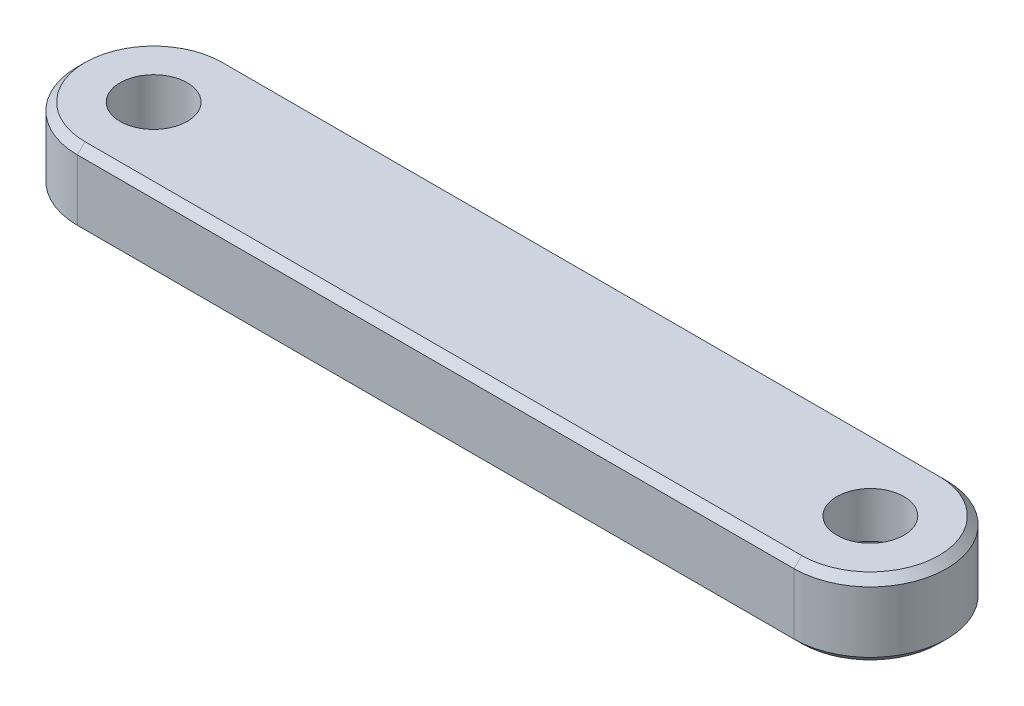
ISO-10303-21;
HEADER;
FILE_DESCRIPTION(('STEP AP214'),'2;1');
FILE_NAME('part.step','',(''),(''),'','','');
FILE_SCHEMA(('AUTOMOTIVE_DESIGN { 1 0 10303 214 1 1 1 1 }'));
ENDSEC;
DATA;
#1=APPLICATION_CONTEXT('core data for automotive mechanical design processes');
#2=APPLICATION_PROTOCOL_DEFINITION('international standard','automotive_design',2000,#1);
#3=PRODUCT_CONTEXT('',#1,'mechanical');
#4=PRODUCT('Part','Part','',(#3));
#5=PRODUCT_RELATED_PRODUCT_CATEGORY('part','',(#4));
#6=PRODUCT_DEFINITION_FORMATION('','',#4);
#7=PRODUCT_DEFINITION_CONTEXT('part definition',#1,'design');
#8=PRODUCT_DEFINITION('design','',#6,#7);
#9=PRODUCT_DEFINITION_SHAPE('','',#8);
#10=(LENGTH_UNIT() NAMED_UNIT(*) SI_UNIT(.MILLI.,.METRE.));
#11=(NAMED_UNIT(*) PLANE_ANGLE_UNIT() SI_UNIT($,.RADIAN.));
#12=(NAMED_UNIT(*) SI_UNIT($,.STERADIAN.) SOLID_ANGLE_UNIT());
#13=UNCERTAINTY_MEASURE_WITH_UNIT(LENGTH_MEASURE(1.E-05),#10,'distance_accuracy_value','');
#14=(GEOMETRIC_REPRESENTATION_CONTEXT(3) GLOBAL_UNCERTAINTY_ASSIGNED_CONTEXT((#13)) GLOBAL_UNIT_ASSIGNED_CONTEXT((#10,
#11,#12)) REPRESENTATION_CONTEXT('',''));
#15=CARTESIAN_POINT('',(0.,0.,0.));
#16=DIRECTION('',(0.,0.,1.));
#17=DIRECTION('',(1.,0.,0.));
#18=AXIS2_PLACEMENT_3D('',#15,#16,#17);
#19=CARTESIAN_POINT('',(47.,-0.0001,0.));
#20=DIRECTION('',(0.,1.,0.));
#21=DIRECTION('',(0.,0.,1.));
#22=AXIS2_PLACEMENT_3D('',#19,#20,#21);
#23=CYLINDRICAL_SURFACE('',#22,2.19999999999998);
#24=CARTESIAN_POINT('',(47.,5.,0.));
#25=DIRECTION('',(0.,1.,0.));
#26=DIRECTION('',(0.,0.,1.));
#27=AXIS2_PLACEMENT_3D('',#24,#25,#26);
#28=CIRCLE('',#27,2.19999999999998);
#29=CARTESIAN_POINT('',(47.,5.,2.19999999999998));
#30=VERTEX_POINT('',#29);
#31=EDGE_CURVE('E250',#30,#30,#28,.T.);
#32=ORIENTED_EDGE('',*,*,#31,.T.);
#33=EDGE_LOOP('',(#32));
#34=FACE_BOUND('',#33,.T.);
#35=CARTESIAN_POINT('',(47.,1.9999,0.));
#36=DIRECTION('',(0.,-1.,0.));
#37=DIRECTION('',(0.,0.,-1.));
#38=AXIS2_PLACEMENT_3D('',#35,#36,#37);
#39=CIRCLE('',#38,2.19999999999998);
#40=CARTESIAN_POINT('',(47.,1.9999,-2.19999999999998));
#41=VERTEX_POINT('',#40);
#42=EDGE_CURVE('E199',#41,#41,#39,.T.);
#43=ORIENTED_EDGE('',*,*,#42,.T.);
#44=EDGE_LOOP('',(#43));
#45=FACE_BOUND('',#44,.T.);
#46=ADVANCED_FACE('F96',(#34,#45),#23,.F.);
#47=CARTESIAN_POINT('',(0.,-0.0001,0.));
#48=DIRECTION('',(0.,1.,0.));
#49=DIRECTION('',(0.,0.,1.));
#50=AXIS2_PLACEMENT_3D('',#47,#48,#49);
#51=CYLINDRICAL_SURFACE('',#50,5.);
#52=DIRECTION('',(0.,1.,0.));
#53=VECTOR('',#52,1.);
#54=CARTESIAN_POINT('',(0.,-0.0001,5.));
#55=LINE('',#54,#53);
#56=CARTESIAN_POINT('',(0.,0.499900000000007,5.));
#57=VERTEX_POINT('',#56);
#58=CARTESIAN_POINT('',(0.,4.50000000000001,5.));
#59=VERTEX_POINT('',#58);
#60=EDGE_CURVE('E235',#57,#59,#55,.T.);
#61=ORIENTED_EDGE('',*,*,#60,.T.);
#62=CARTESIAN_POINT('',(0.,4.50000000000001,0.));
#63=DIRECTION('',(0.,1.,0.));
#64=DIRECTION('',(0.,0.,1.));
#65=AXIS2_PLACEMENT_3D('',#62,#63,#64);
#66=CIRCLE('',#65,5.);
#67=CARTESIAN_POINT('',(0.,4.50000000000001,-5.));
#68=VERTEX_POINT('',#67);
#69=EDGE_CURVE('E210',#59,#68,#66,.F.);
#70=ORIENTED_EDGE('',*,*,#69,.T.);
#71=DIRECTION('',(0.,1.,0.));
#72=VECTOR('',#71,1.);
#73=CARTESIAN_POINT('',(0.,-0.0001,-5.));
#74=LINE('',#73,#72);
#75=CARTESIAN_POINT('',(0.,0.499900000000007,-5.));
#76=VERTEX_POINT('',#75);
#77=EDGE_CURVE('E234',#76,#68,#74,.T.);
#78=ORIENTED_EDGE('',*,*,#77,.F.);
#79=CARTESIAN_POINT('',(0.,0.499900000000007,0.));
#80=DIRECTION('',(0.,1.,0.));
#81=DIRECTION('',(0.,0.,1.));
#82=AXIS2_PLACEMENT_3D('',#79,#80,#81);
#83=CIRCLE('',#82,5.);
#84=EDGE_CURVE('E212',#76,#57,#83,.T.);
#85=ORIENTED_EDGE('',*,*,#84,.T.);
#86=EDGE_LOOP('',(#61,#70,#78,#85));
#87=FACE_BOUND('',#86,.T.);
#88=ADVANCED_FACE('F279',(#87),#51,.T.);
#89=CARTESIAN_POINT('',(0.,-0.0001,-5.));
#90=DIRECTION('',(0.,0.,1.));
#91=DIRECTION('',(1.,0.,0.));
#92=AXIS2_PLACEMENT_3D('',#89,#90,#91);
#93=PLANE('',#92);
#94=ORIENTED_EDGE('',*,*,#77,.T.);
#95=DIRECTION('',(1.,0.,0.));
#96=VECTOR('',#95,1.);
#97=CARTESIAN_POINT('',(47.,4.50000000000001,-5.));
#98=LINE('',#97,#96);
#99=CARTESIAN_POINT('',(47.,4.50000000000001,-5.));
#100=VERTEX_POINT('',#99);
#101=EDGE_CURVE('E12',#68,#100,#98,.T.);
#102=ORIENTED_EDGE('',*,*,#101,.T.);
#103=DIRECTION('',(0.,1.,0.));
#104=VECTOR('',#103,1.);
#105=CARTESIAN_POINT('',(47.,-0.0001,-5.));
#106=LINE('',#105,#104);
#107=CARTESIAN_POINT('',(47.,0.499900000000007,-5.));
#108=VERTEX_POINT('',#107);
#109=EDGE_CURVE('E242',#108,#100,#106,.T.);
#110=ORIENTED_EDGE('',*,*,#109,.F.);
#111=DIRECTION('',(-1.,0.,0.));
#112=VECTOR('',#111,1.);
#113=CARTESIAN_POINT('',(0.,0.499900000000007,-5.));
#114=LINE('',#113,#112);
#115=EDGE_CURVE('E105',#108,#76,#114,.T.);
#116=ORIENTED_EDGE('',*,*,#115,.T.);
#117=EDGE_LOOP('',(#94,#102,#110,#116));
#118=FACE_BOUND('',#117,.T.);
#119=ADVANCED_FACE('F285',(#118),#93,.F.);
#120=CARTESIAN_POINT('',(47.,-0.0001,0.));
#121=DIRECTION('',(0.,1.,0.));
#122=DIRECTION('',(0.,0.,1.));
#123=AXIS2_PLACEMENT_3D('',#120,#121,#122);
#124=CYLINDRICAL_SURFACE('',#123,5.);
#125=ORIENTED_EDGE('',*,*,#109,.T.);
#126=CARTESIAN_POINT('',(47.,4.50000000000001,0.));
#127=DIRECTION('',(0.,1.,0.));
#128=DIRECTION('',(0.,0.,1.));
#129=AXIS2_PLACEMENT_3D('',#126,#127,#128);
#130=CIRCLE('',#129,5.);
#131=CARTESIAN_POINT('',(47.,4.50000000000001,5.));
#132=VERTEX_POINT('',#131);
#133=EDGE_CURVE('E205',#100,#132,#130,.F.);
#134=ORIENTED_EDGE('',*,*,#133,.T.);
#135=DIRECTION('',(0.,1.,0.));
#136=VECTOR('',#135,1.);
#137=CARTESIAN_POINT('',(47.,-0.0001,5.));
#138=LINE('',#137,#136);
#139=CARTESIAN_POINT('',(47.,0.499900000000007,5.));
#140=VERTEX_POINT('',#139);
#141=EDGE_CURVE('E238',#140,#132,#138,.T.);
#142=ORIENTED_EDGE('',*,*,#141,.F.);
#143=CARTESIAN_POINT('',(47.,0.499900000000007,0.));
#144=DIRECTION('',(0.,1.,0.));
#145=DIRECTION('',(0.,0.,1.));
#146=AXIS2_PLACEMENT_3D('',#143,#144,#145);
#147=CIRCLE('',#146,5.);
#148=EDGE_CURVE('E207',#140,#108,#147,.T.);
#149=ORIENTED_EDGE('',*,*,#148,.T.);
#150=EDGE_LOOP('',(#125,#134,#142,#149));
#151=FACE_BOUND('',#150,.T.);
#152=ADVANCED_FACE('F298',(#151),#124,.T.);
#153=CARTESIAN_POINT('',(0.,-0.0001,5.));
#154=DIRECTION('',(0.,0.,1.));
#155=DIRECTION('',(1.,0.,0.));
#156=AXIS2_PLACEMENT_3D('',#153,#154,#155);
#157=PLANE('',#156);
#158=ORIENTED_EDGE('',*,*,#141,.T.);
#159=DIRECTION('',(-1.,0.,0.));
#160=VECTOR('',#159,1.);
#161=CARTESIAN_POINT('',(0.,4.50000000000001,5.));
#162=LINE('',#161,#160);
#163=EDGE_CURVE('E214',#132,#59,#162,.T.);
#164=ORIENTED_EDGE('',*,*,#163,.T.);
#165=ORIENTED_EDGE('',*,*,#60,.F.);
#166=DIRECTION('',(1.,0.,0.));
#167=VECTOR('',#166,1.);
#168=CARTESIAN_POINT('',(47.,0.499900000000007,5.));
#169=LINE('',#168,#167);
#170=EDGE_CURVE('E187',#57,#140,#169,.T.);
#171=ORIENTED_EDGE('',*,*,#170,.T.);
#172=EDGE_LOOP('',(#158,#164,#165,#171));
#173=FACE_BOUND('',#172,.T.);
#174=ADVANCED_FACE('F294',(#173),#157,.T.);
#175=CARTESIAN_POINT('',(0.,-0.0001,0.));
#176=DIRECTION('',(0.,1.,0.));
#177=DIRECTION('',(0.,0.,1.));
#178=AXIS2_PLACEMENT_3D('',#175,#176,#177);
#179=PLANE('',#178);
#180=CARTESIAN_POINT('',(47.,-0.0001,0.));
#181=DIRECTION('',(0.,1.,0.));
#182=DIRECTION('',(0.,0.,1.));
#183=AXIS2_PLACEMENT_3D('',#180,#181,#182);
#184=CIRCLE('',#183,4.00000000000002);
#185=CARTESIAN_POINT('',(47.,-0.0001,4.00000000000002));
#186=VERTEX_POINT('',#185);
#187=EDGE_CURVE('E227',#186,#186,#184,.T.);
#188=ORIENTED_EDGE('',*,*,#187,.T.);
#189=EDGE_LOOP('',(#188));
#190=FACE_BOUND('',#189,.T.);
#191=DIRECTION('',(1.,0.,0.));
#192=VECTOR('',#191,1.);
#193=CARTESIAN_POINT('',(0.,-0.0001,-4.5));
#194=LINE('',#193,#192);
#195=CARTESIAN_POINT('',(0.,-0.0001,-4.5));
#196=VERTEX_POINT('',#195);
#197=CARTESIAN_POINT('',(47.,-0.0001,-4.5));
#198=VERTEX_POINT('',#197);
#199=EDGE_CURVE('E175',#196,#198,#194,.T.);
#200=ORIENTED_EDGE('',*,*,#199,.T.);
#201=CARTESIAN_POINT('',(47.,-0.0001,0.));
#202=DIRECTION('',(0.,1.,0.));
#203=DIRECTION('',(0.,0.,1.));
#204=AXIS2_PLACEMENT_3D('',#201,#202,#203);
#205=CIRCLE('',#204,4.5);
#206=CARTESIAN_POINT('',(47.,-0.0001,4.5));
#207=VERTEX_POINT('',#206);
#208=EDGE_CURVE('E171',#198,#207,#205,.F.);
#209=ORIENTED_EDGE('',*,*,#208,.T.);
#210=DIRECTION('',(-1.,0.,0.));
#211=VECTOR('',#210,1.);
#212=CARTESIAN_POINT('',(0.,-0.0001,4.5));
#213=LINE('',#212,#211);
#214=CARTESIAN_POINT('',(0.,-0.0001,4.5));
#215=VERTEX_POINT('',#214);
#216=EDGE_CURVE('E165',#207,#215,#213,.T.);
#217=ORIENTED_EDGE('',*,*,#216,.T.);
#218=CARTESIAN_POINT('',(0.,-0.0001,0.));
#219=DIRECTION('',(0.,1.,0.));
#220=DIRECTION('',(0.,0.,1.));
#221=AXIS2_PLACEMENT_3D('',#218,#219,#220);
#222=CIRCLE('',#221,4.5);
#223=EDGE_CURVE('E169',#215,#196,#222,.F.);
#224=ORIENTED_EDGE('',*,*,#223,.T.);
#225=EDGE_LOOP('',(#200,#209,#217,#224));
#226=FACE_BOUND('',#225,.T.);
#227=CARTESIAN_POINT('',(0.,-0.0001,0.));
#228=DIRECTION('',(0.,1.,0.));
#229=DIRECTION('',(0.,0.,1.));
#230=AXIS2_PLACEMENT_3D('',#227,#228,#229);
#231=CIRCLE('',#230,2.2);
#232=CARTESIAN_POINT('',(0.,-0.0001,2.2));
#233=VERTEX_POINT('',#232);
#234=EDGE_CURVE('E239',#233,#233,#231,.T.);
#235=ORIENTED_EDGE('',*,*,#234,.T.);
#236=EDGE_LOOP('',(#235));
#237=FACE_BOUND('',#236,.T.);
#238=ADVANCED_FACE('F167',(#190,#226,#237),#179,.F.);
#239=CARTESIAN_POINT('',(0.,-0.0001,0.));
#240=DIRECTION('',(0.,1.,0.));
#241=DIRECTION('',(0.,0.,1.));
#242=AXIS2_PLACEMENT_3D('',#239,#240,#241);
#243=CYLINDRICAL_SURFACE('',#242,2.2);
#244=ORIENTED_EDGE('',*,*,#234,.F.);
#245=EDGE_LOOP('',(#244));
#246=FACE_BOUND('',#245,.T.);
#247=CARTESIAN_POINT('',(0.,5.,0.));
#248=DIRECTION('',(0.,1.,0.));
#249=DIRECTION('',(0.,0.,1.));
#250=AXIS2_PLACEMENT_3D('',#247,#248,#249);
#251=CIRCLE('',#250,2.2);
#252=CARTESIAN_POINT('',(0.,5.,2.2));
#253=VERTEX_POINT('',#252);
#254=EDGE_CURVE('E247',#253,#253,#251,.T.);
#255=ORIENTED_EDGE('',*,*,#254,.T.);
#256=EDGE_LOOP('',(#255));
#257=FACE_BOUND('',#256,.T.);
#258=ADVANCED_FACE('F275',(#246,#257),#243,.F.);
#259=CARTESIAN_POINT('',(0.,5.,0.));
#260=DIRECTION('',(0.,1.,0.));
#261=DIRECTION('',(0.,0.,1.));
#262=AXIS2_PLACEMENT_3D('',#259,#260,#261);
#263=PLANE('',#262);
#264=CARTESIAN_POINT('',(0.,5.,0.));
#265=DIRECTION('',(0.,1.,0.));
#266=DIRECTION('',(0.,0.,1.));
#267=AXIS2_PLACEMENT_3D('',#264,#265,#266);
#268=CIRCLE('',#267,4.5);
#269=CARTESIAN_POINT('',(0.,5.,-4.5));
#270=VERTEX_POINT('',#269);
#271=CARTESIAN_POINT('',(0.,5.,4.5));
#272=VERTEX_POINT('',#271);
#273=EDGE_CURVE('E221',#270,#272,#268,.T.);
#274=ORIENTED_EDGE('',*,*,#273,.T.);
#275=DIRECTION('',(1.,0.,0.));
#276=VECTOR('',#275,1.);
#277=CARTESIAN_POINT('',(0.,5.,4.5));
#278=LINE('',#277,#276);
#279=CARTESIAN_POINT('',(47.,5.,4.5));
#280=VERTEX_POINT('',#279);
#281=EDGE_CURVE('E218',#272,#280,#278,.T.);
#282=ORIENTED_EDGE('',*,*,#281,.T.);
#283=CARTESIAN_POINT('',(47.,5.,0.));
#284=DIRECTION('',(0.,1.,0.));
#285=DIRECTION('',(0.,0.,1.));
#286=AXIS2_PLACEMENT_3D('',#283,#284,#285);
#287=CIRCLE('',#286,4.5);
#288=CARTESIAN_POINT('',(47.,5.,-4.5));
#289=VERTEX_POINT('',#288);
#290=EDGE_CURVE('E223',#280,#289,#287,.T.);
#291=ORIENTED_EDGE('',*,*,#290,.T.);
#292=DIRECTION('',(-1.,0.,0.));
#293=VECTOR('',#292,1.);
#294=CARTESIAN_POINT('',(0.,5.,-4.5));
#295=LINE('',#294,#293);
#296=EDGE_CURVE('E225',#289,#270,#295,.T.);
#297=ORIENTED_EDGE('',*,*,#296,.T.);
#298=EDGE_LOOP('',(#274,#282,#291,#297));
#299=FACE_BOUND('',#298,.T.);
#300=ORIENTED_EDGE('',*,*,#254,.F.);
#301=EDGE_LOOP('',(#300));
#302=FACE_BOUND('',#301,.T.);
#303=ORIENTED_EDGE('',*,*,#31,.F.);
#304=EDGE_LOOP('',(#303));
#305=FACE_BOUND('',#304,.T.);
#306=ADVANCED_FACE('F269',(#299,#302,#305),#263,.T.);
#307=CARTESIAN_POINT('',(47.,1.9999,0.));
#308=DIRECTION('',(0.,-1.,0.));
#309=DIRECTION('',(0.,0.,-1.));
#310=AXIS2_PLACEMENT_3D('',#307,#308,#309);
#311=CYLINDRICAL_SURFACE('',#310,3.5);
#312=CARTESIAN_POINT('',(47.,0.499900000000016,0.));
#313=DIRECTION('',(0.,1.,0.));
#314=DIRECTION('',(0.,0.,1.));
#315=AXIS2_PLACEMENT_3D('',#312,#313,#314);
#316=CIRCLE('',#315,3.5);
#317=CARTESIAN_POINT('',(47.,0.499900000000016,3.5));
#318=VERTEX_POINT('',#317);
#319=EDGE_CURVE('E184',#318,#318,#316,.F.);
#320=ORIENTED_EDGE('',*,*,#319,.T.);
#321=EDGE_LOOP('',(#320));
#322=FACE_BOUND('',#321,.T.);
#323=CARTESIAN_POINT('',(47.,1.9999,0.));
#324=DIRECTION('',(0.,-1.,0.));
#325=DIRECTION('',(0.,0.,-1.));
#326=AXIS2_PLACEMENT_3D('',#323,#324,#325);
#327=CIRCLE('',#326,3.5);
#328=CARTESIAN_POINT('',(47.,1.9999,-3.5));
#329=VERTEX_POINT('',#328);
#330=EDGE_CURVE('E253',#329,#329,#327,.T.);
#331=ORIENTED_EDGE('',*,*,#330,.F.);
#332=EDGE_LOOP('',(#331));
#333=FACE_BOUND('',#332,.T.);
#334=ADVANCED_FACE('F264',(#322,#333),#311,.F.);
#335=CARTESIAN_POINT('',(47.,1.9999,0.));
#336=DIRECTION('',(0.,-1.,0.));
#337=DIRECTION('',(0.,0.,-1.));
#338=AXIS2_PLACEMENT_3D('',#335,#336,#337);
#339=PLANE('',#338);
#340=ORIENTED_EDGE('',*,*,#42,.F.);
#341=EDGE_LOOP('',(#340));
#342=FACE_BOUND('',#341,.T.);
#343=ORIENTED_EDGE('',*,*,#330,.T.);
#344=EDGE_LOOP('',(#343));
#345=FACE_BOUND('',#344,.T.);
#346=ADVANCED_FACE('F260',(#342,#345),#339,.T.);
#347=CARTESIAN_POINT('',(47.,0.499900000000016,0.));
#348=DIRECTION('',(0.,-1.,0.));
#349=DIRECTION('',(0.,0.,-1.));
#350=AXIS2_PLACEMENT_3D('',#347,#348,#349);
#351=CONICAL_SURFACE('',#350,3.5,0.78539816339745);
#352=ORIENTED_EDGE('',*,*,#187,.F.);
#353=EDGE_LOOP('',(#352));
#354=FACE_BOUND('',#353,.T.);
#355=ORIENTED_EDGE('',*,*,#319,.F.);
#356=EDGE_LOOP('',(#355));
#357=FACE_BOUND('',#356,.T.);
#358=ADVANCED_FACE('F263',(#354,#357),#351,.F.);
#359=CARTESIAN_POINT('',(0.,4.50000000000001,-5.));
#360=DIRECTION('',(0.,0.707106781186552,-0.707106781186543));
#361=DIRECTION('',(-1.,0.,0.));
#362=AXIS2_PLACEMENT_3D('',#359,#360,#361);
#363=PLANE('',#362);
#364=DIRECTION('',(0.,0.707106781186543,0.707106781186552));
#365=VECTOR('',#364,1.);
#366=CARTESIAN_POINT('',(47.,4.50000000000001,-5.));
#367=LINE('',#366,#365);
#368=EDGE_CURVE('E200',#100,#289,#367,.T.);
#369=ORIENTED_EDGE('',*,*,#368,.F.);
#370=ORIENTED_EDGE('',*,*,#101,.F.);
#371=DIRECTION('',(0.,-0.707106781186543,-0.707106781186552));
#372=VECTOR('',#371,1.);
#373=CARTESIAN_POINT('',(0.,5.,-4.5));
#374=LINE('',#373,#372);
#375=EDGE_CURVE('E196',#270,#68,#374,.T.);
#376=ORIENTED_EDGE('',*,*,#375,.F.);
#377=ORIENTED_EDGE('',*,*,#296,.F.);
#378=EDGE_LOOP('',(#369,#370,#376,#377));
#379=FACE_BOUND('',#378,.T.);
#380=ADVANCED_FACE('F307',(#379),#363,.T.);
#381=CARTESIAN_POINT('',(0.,5.,0.));
#382=DIRECTION('',(0.,-1.,0.));
#383=DIRECTION('',(0.,0.,-1.));
#384=AXIS2_PLACEMENT_3D('',#381,#382,#383);
#385=CONICAL_SURFACE('',#384,4.5,0.785398163397455);
#386=ORIENTED_EDGE('',*,*,#375,.T.);
#387=ORIENTED_EDGE('',*,*,#69,.F.);
#388=DIRECTION('',(0.,-0.707106781186543,0.707106781186552));
#389=VECTOR('',#388,1.);
#390=CARTESIAN_POINT('',(0.,5.,4.5));
#391=LINE('',#390,#389);
#392=EDGE_CURVE('E189',#272,#59,#391,.T.);
#393=ORIENTED_EDGE('',*,*,#392,.F.);
#394=ORIENTED_EDGE('',*,*,#273,.F.);
#395=EDGE_LOOP('',(#386,#387,#393,#394));
#396=FACE_BOUND('',#395,.T.);
#397=ADVANCED_FACE('F316',(#396),#385,.T.);
#398=CARTESIAN_POINT('',(47.,5.,0.));
#399=DIRECTION('',(0.,-1.,0.));
#400=DIRECTION('',(0.,0.,-1.));
#401=AXIS2_PLACEMENT_3D('',#398,#399,#400);
#402=CONICAL_SURFACE('',#401,4.5,0.785398163397455);
#403=ORIENTED_EDGE('',*,*,#368,.T.);
#404=ORIENTED_EDGE('',*,*,#290,.F.);
#405=DIRECTION('',(0.,0.707106781186543,-0.707106781186552));
#406=VECTOR('',#405,1.);
#407=CARTESIAN_POINT('',(47.,4.50000000000001,5.));
#408=LINE('',#407,#406);
#409=EDGE_CURVE('E188',#132,#280,#408,.T.);
#410=ORIENTED_EDGE('',*,*,#409,.F.);
#411=ORIENTED_EDGE('',*,*,#133,.F.);
#412=EDGE_LOOP('',(#403,#404,#410,#411));
#413=FACE_BOUND('',#412,.T.);
#414=ADVANCED_FACE('F312',(#413),#402,.T.);
#415=CARTESIAN_POINT('',(0.,5.,4.5));
#416=DIRECTION('',(0.,-0.707106781186552,-0.707106781186543));
#417=DIRECTION('',(1.,0.,0.));
#418=AXIS2_PLACEMENT_3D('',#415,#416,#417);
#419=PLANE('',#418);
#420=ORIENTED_EDGE('',*,*,#392,.T.);
#421=ORIENTED_EDGE('',*,*,#163,.F.);
#422=ORIENTED_EDGE('',*,*,#409,.T.);
#423=ORIENTED_EDGE('',*,*,#281,.F.);
#424=EDGE_LOOP('',(#420,#421,#422,#423));
#425=FACE_BOUND('',#424,.T.);
#426=ADVANCED_FACE('F309',(#425),#419,.F.);
#427=CARTESIAN_POINT('',(0.,0.499900000000007,0.));
#428=DIRECTION('',(0.,1.,0.));
#429=DIRECTION('',(0.,0.,1.));
#430=AXIS2_PLACEMENT_3D('',#427,#428,#429);
#431=CONICAL_SURFACE('',#430,5.,0.785398163397445);
#432=DIRECTION('',(0.,0.70710678118655,-0.707106781186545));
#433=VECTOR('',#432,1.);
#434=CARTESIAN_POINT('',(0.,-0.0001,-4.5));
#435=LINE('',#434,#433);
#436=EDGE_CURVE('E182',#196,#76,#435,.T.);
#437=ORIENTED_EDGE('',*,*,#436,.F.);
#438=ORIENTED_EDGE('',*,*,#223,.F.);
#439=DIRECTION('',(0.,-0.70710678118655,-0.707106781186545));
#440=VECTOR('',#439,1.);
#441=CARTESIAN_POINT('',(0.,0.499900000000007,5.));
#442=LINE('',#441,#440);
#443=EDGE_CURVE('E100',#57,#215,#442,.T.);
#444=ORIENTED_EDGE('',*,*,#443,.F.);
#445=ORIENTED_EDGE('',*,*,#84,.F.);
#446=EDGE_LOOP('',(#437,#438,#444,#445));
#447=FACE_BOUND('',#446,.T.);
#448=ADVANCED_FACE('F98',(#447),#431,.T.);
#449=CARTESIAN_POINT('',(0.,0.499900000000007,5.));
#450=DIRECTION('',(0.,-0.707106781186545,0.70710678118655));
#451=DIRECTION('',(-1.,0.,0.));
#452=AXIS2_PLACEMENT_3D('',#449,#450,#451);
#453=PLANE('',#452);
#454=ORIENTED_EDGE('',*,*,#443,.T.);
#455=ORIENTED_EDGE('',*,*,#216,.F.);
#456=DIRECTION('',(0.,-0.70710678118655,-0.707106781186545));
#457=VECTOR('',#456,1.);
#458=CARTESIAN_POINT('',(47.,0.499900000000007,5.));
#459=LINE('',#458,#457);
#460=EDGE_CURVE('E191',#140,#207,#459,.T.);
#461=ORIENTED_EDGE('',*,*,#460,.F.);
#462=ORIENTED_EDGE('',*,*,#170,.F.);
#463=EDGE_LOOP('',(#454,#455,#461,#462));
#464=FACE_BOUND('',#463,.T.);
#465=ADVANCED_FACE('F186',(#464),#453,.T.);
#466=CARTESIAN_POINT('',(0.,-0.0001,-4.5));
#467=DIRECTION('',(0.,0.707106781186545,0.70710678118655));
#468=DIRECTION('',(1.,0.,0.));
#469=AXIS2_PLACEMENT_3D('',#466,#467,#468);
#470=PLANE('',#469);
#471=ORIENTED_EDGE('',*,*,#436,.T.);
#472=ORIENTED_EDGE('',*,*,#115,.F.);
#473=DIRECTION('',(0.,0.70710678118655,-0.707106781186545));
#474=VECTOR('',#473,1.);
#475=CARTESIAN_POINT('',(47.,-0.0001,-4.5));
#476=LINE('',#475,#474);
#477=EDGE_CURVE('E119',#198,#108,#476,.T.);
#478=ORIENTED_EDGE('',*,*,#477,.F.);
#479=ORIENTED_EDGE('',*,*,#199,.F.);
#480=EDGE_LOOP('',(#471,#472,#478,#479));
#481=FACE_BOUND('',#480,.T.);
#482=ADVANCED_FACE('F327',(#481),#470,.F.);
#483=CARTESIAN_POINT('',(47.,0.499900000000007,0.));
#484=DIRECTION('',(0.,1.,0.));
#485=DIRECTION('',(0.,0.,1.));
#486=AXIS2_PLACEMENT_3D('',#483,#484,#485);
#487=CONICAL_SURFACE('',#486,5.,0.785398163397445);
#488=ORIENTED_EDGE('',*,*,#460,.T.);
#489=ORIENTED_EDGE('',*,*,#208,.F.);
#490=ORIENTED_EDGE('',*,*,#477,.T.);
#491=ORIENTED_EDGE('',*,*,#148,.F.);
#492=EDGE_LOOP('',(#488,#489,#490,#491));
#493=FACE_BOUND('',#492,.T.);
#494=ADVANCED_FACE('F324',(#493),#487,.T.);
#495=CLOSED_SHELL('',(#46,#88,#119,#152,#174,#238,#258,#306,#334,#346,#358,#380,#397,#414,#426,
#448,#465,#482,#494));
#496=MANIFOLD_SOLID_BREP('B2',#495);
#497=ADVANCED_BREP_SHAPE_REPRESENTATION('',(#18,#496),#14);
#498=SHAPE_DEFINITION_REPRESENTATION(#9,#497);
ENDSEC;
END-ISO-10303-21;
